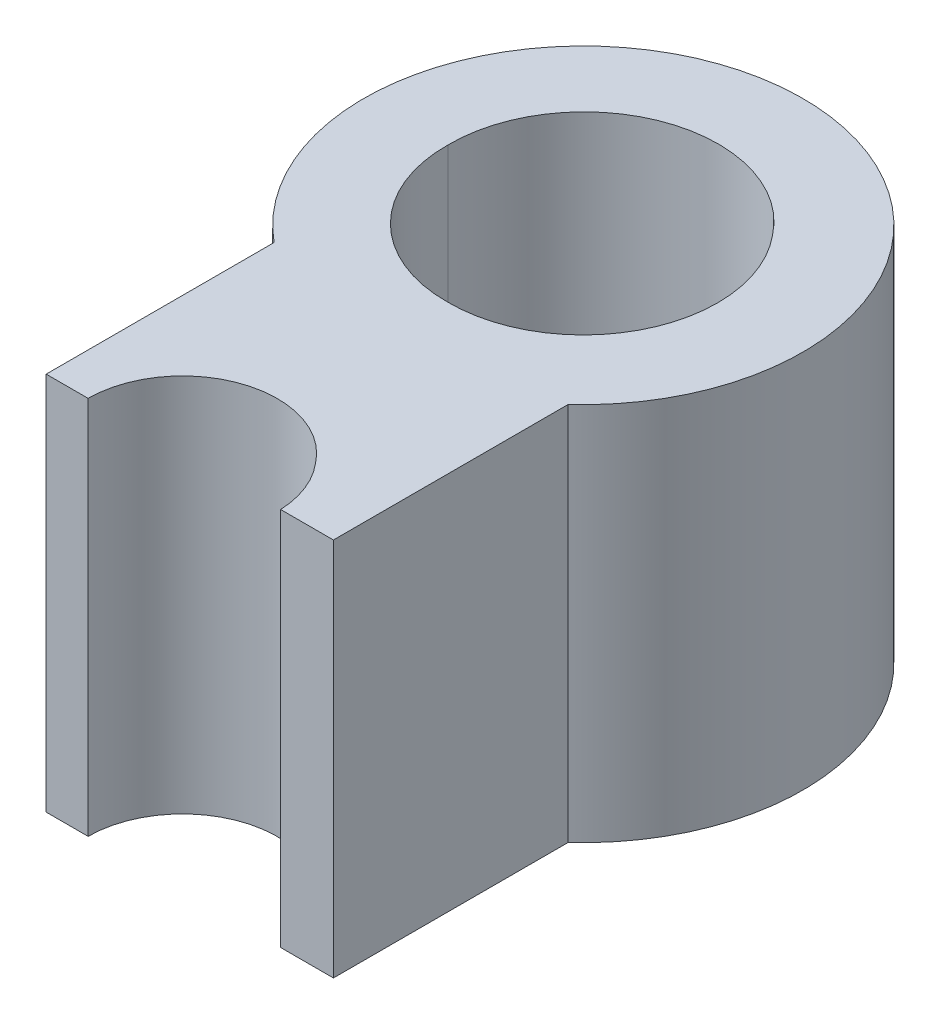
ISO-10303-21;
HEADER;
FILE_DESCRIPTION(('STEP AP214'),'2;1');
FILE_NAME('part.step','',(''),(''),'','','');
FILE_SCHEMA(('AUTOMOTIVE_DESIGN { 1 0 10303 214 1 1 1 1 }'));
ENDSEC;
DATA;
#1=APPLICATION_CONTEXT('core data for automotive mechanical design processes');
#2=APPLICATION_PROTOCOL_DEFINITION('international standard','automotive_design',2000,#1);
#3=PRODUCT_CONTEXT('',#1,'mechanical');
#4=PRODUCT('Part','Part','',(#3));
#5=PRODUCT_RELATED_PRODUCT_CATEGORY('part','',(#4));
#6=PRODUCT_DEFINITION_FORMATION('','',#4);
#7=PRODUCT_DEFINITION_CONTEXT('part definition',#1,'design');
#8=PRODUCT_DEFINITION('design','',#6,#7);
#9=PRODUCT_DEFINITION_SHAPE('','',#8);
#10=(LENGTH_UNIT() NAMED_UNIT(*) SI_UNIT(.MILLI.,.METRE.));
#11=(NAMED_UNIT(*) PLANE_ANGLE_UNIT() SI_UNIT($,.RADIAN.));
#12=(NAMED_UNIT(*) SI_UNIT($,.STERADIAN.) SOLID_ANGLE_UNIT());
#13=UNCERTAINTY_MEASURE_WITH_UNIT(LENGTH_MEASURE(1.E-05),#10,'distance_accuracy_value','');
#14=(GEOMETRIC_REPRESENTATION_CONTEXT(3) GLOBAL_UNCERTAINTY_ASSIGNED_CONTEXT((#13)) GLOBAL_UNIT_ASSIGNED_CONTEXT((#10,
#11,#12)) REPRESENTATION_CONTEXT('',''));
#15=CARTESIAN_POINT('',(0.,0.,0.));
#16=DIRECTION('',(0.,0.,1.));
#17=DIRECTION('',(1.,0.,0.));
#18=AXIS2_PLACEMENT_3D('',#15,#16,#17);
#19=CARTESIAN_POINT('',(1.26536763995187,2.87183105039429,15.59112871048));
#20=DIRECTION('',(0.,1.,0.));
#21=DIRECTION('',(0.,0.,-1.));
#22=AXIS2_PLACEMENT_3D('',#19,#20,#21);
#23=PLANE('',#22);
#24=CARTESIAN_POINT('',(-1.36353236004818,2.87183105039429,23.2098996244558));
#25=DIRECTION('',(0.,1.,0.));
#26=DIRECTION('',(0.,0.,-1.));
#27=AXIS2_PLACEMENT_3D('',#24,#25,#26);
#28=CIRCLE('',#27,0.425);
#29=CARTESIAN_POINT('',(-1.78849365773671,2.87183105039429,23.204164167466));
#30=VERTEX_POINT('',#29);
#31=CARTESIAN_POINT('',(-1.35891580266906,2.87183105039429,23.6348745500666));
#32=VERTEX_POINT('',#31);
#33=EDGE_CURVE('E179',#30,#32,#28,.T.);
#34=ORIENTED_EDGE('',*,*,#33,.F.);
#35=CARTESIAN_POINT('',(-1.36353236004812,2.87183105039429,23.1984287104753));
#36=DIRECTION('',(0.,1.,0.));
#37=DIRECTION('',(0.,0.,1.));
#38=AXIS2_PLACEMENT_3D('',#35,#36,#37);
#39=CIRCLE('',#38,0.425);
#40=CARTESIAN_POINT('',(-1.02789155250383,2.87183105039429,22.9377176667674));
#41=VERTEX_POINT('',#40);
#42=EDGE_CURVE('E219',#41,#30,#39,.T.);
#43=ORIENTED_EDGE('',*,*,#42,.F.);
#44=CARTESIAN_POINT('',(-1.35429924528842,2.87183105039429,23.2098996244558));
#45=DIRECTION('',(0.,1.,0.));
#46=DIRECTION('',(0.,0.,-1.));
#47=AXIS2_PLACEMENT_3D('',#44,#45,#46);
#48=CIRCLE('',#47,0.425);
#49=EDGE_CURVE('E156',#32,#41,#48,.T.);
#50=ORIENTED_EDGE('',*,*,#49,.F.);
#51=EDGE_LOOP('',(#34,#43,#50));
#52=FACE_BOUND('',#51,.T.);
#53=CARTESIAN_POINT('',(-1.3542992452884,2.87183105039429,24.4798996244558));
#54=DIRECTION('',(0.,1.,0.));
#55=DIRECTION('',(0.999103542626486,0.,-0.0423333333344553));
#56=AXIS2_PLACEMENT_3D('',#53,#54,#55);
#57=CIRCLE('',#56,0.299999999999992);
#58=CARTESIAN_POINT('',(-1.05456818250046,2.87183105039429,24.4671996244555));
#59=VERTEX_POINT('',#58);
#60=CARTESIAN_POINT('',(-1.12528694577581,2.87183105039429,24.2861127139795));
#61=VERTEX_POINT('',#60);
#62=EDGE_CURVE('E124',#59,#61,#57,.T.);
#63=ORIENTED_EDGE('',*,*,#62,.F.);
#64=DIRECTION('',(-1.,0.,-1.06337566312106E-12));
#65=VECTOR('',#64,1.);
#66=CARTESIAN_POINT('',(-0.887484441405778,2.87183105039429,24.4671996244556));
#67=LINE('',#66,#65);
#68=CARTESIAN_POINT('',(-0.887484441405778,2.87183105039429,24.4671996244556));
#69=VERTEX_POINT('',#68);
#70=EDGE_CURVE('E225',#69,#59,#67,.T.);
#71=ORIENTED_EDGE('',*,*,#70,.F.);
#72=DIRECTION('',(5.02522919053297E-13,0.,-1.));
#73=VECTOR('',#72,1.);
#74=CARTESIAN_POINT('',(-0.887484441405778,2.87183105039429,24.4671996244556));
#75=LINE('',#74,#73);
#76=CARTESIAN_POINT('',(-0.887484441405405,2.87183105039429,23.7245472516448));
#77=VERTEX_POINT('',#76);
#78=EDGE_CURVE('E25',#69,#77,#75,.T.);
#79=ORIENTED_EDGE('',*,*,#78,.T.);
#80=CARTESIAN_POINT('',(-1.35429924528842,2.87183105039429,23.2098996244558));
#81=DIRECTION('',(0.,1.,0.));
#82=DIRECTION('',(0.,0.,-1.));
#83=AXIS2_PLACEMENT_3D('',#80,#81,#82);
#84=CIRCLE('',#83,0.694822453073876);
#85=CARTESIAN_POINT('',(-1.79617833416789,2.87183105039429,23.7461095759735));
#86=VERTEX_POINT('',#85);
#87=EDGE_CURVE('E11',#77,#86,#84,.T.);
#88=ORIENTED_EDGE('',*,*,#87,.T.);
#89=DIRECTION('',(-5.6636748734305E-13,0.,-1.));
#90=VECTOR('',#89,1.);
#91=CARTESIAN_POINT('',(-1.79617833416748,2.87183105039429,24.467199624456));
#92=LINE('',#91,#90);
#93=CARTESIAN_POINT('',(-1.79617833416748,2.87183105039429,24.467199624456));
#94=VERTEX_POINT('',#93);
#95=EDGE_CURVE('E198',#94,#86,#92,.T.);
#96=ORIENTED_EDGE('',*,*,#95,.F.);
#97=DIRECTION('',(1.,0.,-1.62432664225037E-12));
#98=VECTOR('',#97,1.);
#99=CARTESIAN_POINT('',(-1.79617833416748,2.87183105039429,24.467199624456));
#100=LINE('',#99,#98);
#101=CARTESIAN_POINT('',(-1.66352984228345,2.87183105039429,24.4671996244558));
#102=VERTEX_POINT('',#101);
#103=EDGE_CURVE('E129',#94,#102,#100,.T.);
#104=ORIENTED_EDGE('',*,*,#103,.T.);
#105=CARTESIAN_POINT('',(-1.3635323600481,2.87183105039429,24.4684287104753));
#106=DIRECTION('',(0.,1.,0.));
#107=DIRECTION('',(0.999103542626609,0.,0.0423333333315546));
#108=AXIS2_PLACEMENT_3D('',#105,#106,#107);
#109=CIRCLE('',#108,0.299999999999991);
#110=EDGE_CURVE('E128',#61,#102,#109,.T.);
#111=ORIENTED_EDGE('',*,*,#110,.F.);
#112=EDGE_LOOP('',(#63,#71,#79,#88,#96,#104,#111));
#113=FACE_BOUND('',#112,.T.);
#114=ADVANCED_FACE('F17',(#52,#113),#23,.T.);
#115=CARTESIAN_POINT('',(-1.35429924528842,2.87183105039429,23.2098996244558));
#116=DIRECTION('',(0.,-1.,0.));
#117=DIRECTION('',(0.,0.,-1.));
#118=AXIS2_PLACEMENT_3D('',#115,#116,#117);
#119=CYLINDRICAL_SURFACE('',#118,0.694822453073876);
#120=CARTESIAN_POINT('',(-1.35429924528842,1.6718310055699,23.2098996244558));
#121=DIRECTION('',(0.,1.,0.));
#122=DIRECTION('',(0.,0.,-1.));
#123=AXIS2_PLACEMENT_3D('',#120,#121,#122);
#124=CIRCLE('',#123,0.694822453073876);
#125=CARTESIAN_POINT('',(-0.887484441405397,1.6718310055699,23.7245472516448));
#126=VERTEX_POINT('',#125);
#127=CARTESIAN_POINT('',(-1.79617833416788,1.6718310055699,23.7461095759735));
#128=VERTEX_POINT('',#127);
#129=EDGE_CURVE('E164',#126,#128,#124,.T.);
#130=ORIENTED_EDGE('',*,*,#129,.T.);
#131=DIRECTION('',(0.,-1.,0.));
#132=VECTOR('',#131,1.);
#133=CARTESIAN_POINT('',(-1.79617833416789,2.87183105039429,23.7461095759735));
#134=LINE('',#133,#132);
#135=EDGE_CURVE('E204',#86,#128,#134,.T.);
#136=ORIENTED_EDGE('',*,*,#135,.F.);
#137=ORIENTED_EDGE('',*,*,#87,.F.);
#138=DIRECTION('',(0.,-1.,0.));
#139=VECTOR('',#138,1.);
#140=CARTESIAN_POINT('',(-0.887484441405405,2.87183105039429,23.7245472516448));
#141=LINE('',#140,#139);
#142=EDGE_CURVE('E228',#77,#126,#141,.T.);
#143=ORIENTED_EDGE('',*,*,#142,.T.);
#144=EDGE_LOOP('',(#130,#136,#137,#143));
#145=FACE_BOUND('',#144,.T.);
#146=ADVANCED_FACE('F238',(#145),#119,.T.);
#147=CARTESIAN_POINT('',(-0.887484441405405,2.87183105039429,23.7245472516448));
#148=DIRECTION('',(1.,0.,5.02522919053297E-13));
#149=DIRECTION('',(-5.02522919053297E-13,0.,1.));
#150=AXIS2_PLACEMENT_3D('',#147,#148,#149);
#151=PLANE('',#150);
#152=DIRECTION('',(5.02522919053297E-13,0.,-1.));
#153=VECTOR('',#152,1.);
#154=CARTESIAN_POINT('',(-0.887484441403361,1.6718310055699,19.6578379810618));
#155=LINE('',#154,#153);
#156=CARTESIAN_POINT('',(-0.88748444140577,1.6718310055699,24.4671996244556));
#157=VERTEX_POINT('',#156);
#158=EDGE_CURVE('E168',#157,#126,#155,.T.);
#159=ORIENTED_EDGE('',*,*,#158,.T.);
#160=ORIENTED_EDGE('',*,*,#142,.F.);
#161=ORIENTED_EDGE('',*,*,#78,.F.);
#162=DIRECTION('',(0.,-1.,0.));
#163=VECTOR('',#162,1.);
#164=CARTESIAN_POINT('',(-0.887484441405778,2.87183105039429,24.4671996244556));
#165=LINE('',#164,#163);
#166=EDGE_CURVE('E222',#69,#157,#165,.T.);
#167=ORIENTED_EDGE('',*,*,#166,.T.);
#168=EDGE_LOOP('',(#159,#160,#161,#167));
#169=FACE_BOUND('',#168,.T.);
#170=ADVANCED_FACE('F236',(#169),#151,.T.);
#171=CARTESIAN_POINT('',(-0.887484441405778,2.87183105039429,24.4671996244556));
#172=DIRECTION('',(-1.06337566312106E-12,0.,1.));
#173=DIRECTION('',(1.,0.,1.06337566312106E-12));
#174=AXIS2_PLACEMENT_3D('',#171,#172,#173);
#175=PLANE('',#174);
#176=DIRECTION('',(1.,0.,1.06337566312106E-12));
#177=VECTOR('',#176,1.);
#178=CARTESIAN_POINT('',(0.188941599268329,1.6718310055699,24.4671996244568));
#179=LINE('',#178,#177);
#180=CARTESIAN_POINT('',(-1.05456818250045,1.6718310055699,24.4671996244555));
#181=VERTEX_POINT('',#180);
#182=EDGE_CURVE('E146',#181,#157,#179,.T.);
#183=ORIENTED_EDGE('',*,*,#182,.T.);
#184=ORIENTED_EDGE('',*,*,#166,.F.);
#185=ORIENTED_EDGE('',*,*,#70,.T.);
#186=DIRECTION('',(0.,-1.,0.));
#187=VECTOR('',#186,1.);
#188=CARTESIAN_POINT('',(-1.05456818250046,2.87183105039429,24.4671996244555));
#189=LINE('',#188,#187);
#190=EDGE_CURVE('E214',#59,#181,#189,.T.);
#191=ORIENTED_EDGE('',*,*,#190,.T.);
#192=EDGE_LOOP('',(#183,#184,#185,#191));
#193=FACE_BOUND('',#192,.T.);
#194=ADVANCED_FACE('F285',(#193),#175,.T.);
#195=CARTESIAN_POINT('',(-1.36353236004812,2.87183105039429,23.1984287104753));
#196=DIRECTION('',(0.,-1.,0.));
#197=DIRECTION('',(-0.330611026415633,0.,-0.943767105387977));
#198=AXIS2_PLACEMENT_3D('',#195,#196,#197);
#199=CYLINDRICAL_SURFACE('',#198,0.425);
#200=CARTESIAN_POINT('',(-1.36353236004812,1.6718310055699,23.1984287104753));
#201=DIRECTION('',(0.,-1.,0.));
#202=DIRECTION('',(0.,0.,1.));
#203=AXIS2_PLACEMENT_3D('',#200,#201,#202);
#204=CIRCLE('',#203,0.425);
#205=CARTESIAN_POINT('',(-1.7884936577367,1.6718310055699,23.204164167466));
#206=VERTEX_POINT('',#205);
#207=CARTESIAN_POINT('',(-1.02789155250382,1.6718310055699,22.9377176667674));
#208=VERTEX_POINT('',#207);
#209=EDGE_CURVE('E157',#206,#208,#204,.T.);
#210=ORIENTED_EDGE('',*,*,#209,.T.);
#211=DIRECTION('',(0.,-1.,0.));
#212=VECTOR('',#211,1.);
#213=CARTESIAN_POINT('',(-1.02789155250383,2.87183105039429,22.9377176667674));
#214=LINE('',#213,#212);
#215=EDGE_CURVE('E190',#41,#208,#214,.T.);
#216=ORIENTED_EDGE('',*,*,#215,.F.);
#217=ORIENTED_EDGE('',*,*,#42,.T.);
#218=DIRECTION('',(0.,-1.,0.));
#219=VECTOR('',#218,1.);
#220=CARTESIAN_POINT('',(-1.78849365773671,2.87183105039429,23.204164167466));
#221=LINE('',#220,#219);
#222=EDGE_CURVE('E183',#30,#206,#221,.T.);
#223=ORIENTED_EDGE('',*,*,#222,.T.);
#224=EDGE_LOOP('',(#210,#216,#217,#223));
#225=FACE_BOUND('',#224,.T.);
#226=ADVANCED_FACE('F270',(#225),#199,.F.);
#227=CARTESIAN_POINT('',(-1.3542992452884,2.87183105039429,24.4798996244558));
#228=DIRECTION('',(0.,-1.,0.));
#229=DIRECTION('',(0.999103542626486,0.,-0.0423333333344553));
#230=AXIS2_PLACEMENT_3D('',#227,#228,#229);
#231=CYLINDRICAL_SURFACE('',#230,0.299999999999992);
#232=CARTESIAN_POINT('',(-1.3542992452884,1.6718310055699,24.4798996244558));
#233=DIRECTION('',(0.,-1.,0.));
#234=DIRECTION('',(0.999103542626486,0.,-0.0423333333344553));
#235=AXIS2_PLACEMENT_3D('',#232,#233,#234);
#236=CIRCLE('',#235,0.299999999999992);
#237=CARTESIAN_POINT('',(-1.1252869457758,1.6718310055699,24.2861127139795));
#238=VERTEX_POINT('',#237);
#239=EDGE_CURVE('E122',#238,#181,#236,.T.);
#240=ORIENTED_EDGE('',*,*,#239,.T.);
#241=ORIENTED_EDGE('',*,*,#190,.F.);
#242=ORIENTED_EDGE('',*,*,#62,.T.);
#243=DIRECTION('',(0.,-1.,0.));
#244=VECTOR('',#243,1.);
#245=CARTESIAN_POINT('',(-1.12528694577581,2.87183105039429,24.2861127139795));
#246=LINE('',#245,#244);
#247=EDGE_CURVE('E117',#61,#238,#246,.T.);
#248=ORIENTED_EDGE('',*,*,#247,.T.);
#249=EDGE_LOOP('',(#240,#241,#242,#248));
#250=FACE_BOUND('',#249,.T.);
#251=ADVANCED_FACE('F119',(#250),#231,.F.);
#252=CARTESIAN_POINT('',(-1.3635323600481,2.87183105039429,24.4684287104753));
#253=DIRECTION('',(0.,-1.,0.));
#254=DIRECTION('',(-0.31887731463319,0.,-0.947796000314585));
#255=AXIS2_PLACEMENT_3D('',#252,#253,#254);
#256=CYLINDRICAL_SURFACE('',#255,0.299999999999991);
#257=CARTESIAN_POINT('',(-1.3635323600481,1.6718310055699,24.4684287104753));
#258=DIRECTION('',(0.,-1.,0.));
#259=DIRECTION('',(0.999103542626609,0.,0.0423333333315546));
#260=AXIS2_PLACEMENT_3D('',#257,#258,#259);
#261=CIRCLE('',#260,0.299999999999991);
#262=CARTESIAN_POINT('',(-1.66352984228344,1.6718310055699,24.4671996244558));
#263=VERTEX_POINT('',#262);
#264=EDGE_CURVE('E132',#263,#238,#261,.T.);
#265=ORIENTED_EDGE('',*,*,#264,.T.);
#266=ORIENTED_EDGE('',*,*,#247,.F.);
#267=ORIENTED_EDGE('',*,*,#110,.T.);
#268=DIRECTION('',(0.,-1.,0.));
#269=VECTOR('',#268,1.);
#270=CARTESIAN_POINT('',(-1.66352984228345,2.87183105039429,24.4671996244558));
#271=LINE('',#270,#269);
#272=EDGE_CURVE('E135',#102,#263,#271,.T.);
#273=ORIENTED_EDGE('',*,*,#272,.T.);
#274=EDGE_LOOP('',(#265,#266,#267,#273));
#275=FACE_BOUND('',#274,.T.);
#276=ADVANCED_FACE('F133',(#275),#256,.F.);
#277=CARTESIAN_POINT('',(-1.66352984228345,2.87183105039429,24.4671996244558));
#278=DIRECTION('',(1.62432664225037E-12,0.,1.));
#279=DIRECTION('',(1.,0.,-1.62432664225037E-12));
#280=AXIS2_PLACEMENT_3D('',#277,#278,#279);
#281=PLANE('',#280);
#282=DIRECTION('',(1.,0.,-1.62432664225037E-12));
#283=VECTOR('',#282,1.);
#284=CARTESIAN_POINT('',(-0.19908110115858,1.6718310055699,24.4671996244534));
#285=LINE('',#284,#283);
#286=CARTESIAN_POINT('',(-1.79617833416747,1.6718310055699,24.467199624456));
#287=VERTEX_POINT('',#286);
#288=EDGE_CURVE('E140',#287,#263,#285,.T.);
#289=ORIENTED_EDGE('',*,*,#288,.T.);
#290=ORIENTED_EDGE('',*,*,#272,.F.);
#291=ORIENTED_EDGE('',*,*,#103,.F.);
#292=DIRECTION('',(0.,-1.,0.));
#293=VECTOR('',#292,1.);
#294=CARTESIAN_POINT('',(-1.79617833416748,2.87183105039429,24.467199624456));
#295=LINE('',#294,#293);
#296=EDGE_CURVE('E182',#94,#287,#295,.T.);
#297=ORIENTED_EDGE('',*,*,#296,.T.);
#298=EDGE_LOOP('',(#289,#290,#291,#297));
#299=FACE_BOUND('',#298,.T.);
#300=ADVANCED_FACE('F244',(#299),#281,.T.);
#301=CARTESIAN_POINT('',(-1.79617833416748,2.87183105039429,24.467199624456));
#302=DIRECTION('',(-1.,0.,5.6636748734305E-13));
#303=DIRECTION('',(0.,1.,0.));
#304=AXIS2_PLACEMENT_3D('',#301,#302,#303);
#305=PLANE('',#304);
#306=DIRECTION('',(5.6636748734305E-13,0.,1.));
#307=VECTOR('',#306,1.);
#308=CARTESIAN_POINT('',(-1.79617833416999,1.6718310055699,20.0291641674689));
#309=LINE('',#308,#307);
#310=EDGE_CURVE('E159',#128,#287,#309,.T.);
#311=ORIENTED_EDGE('',*,*,#310,.T.);
#312=ORIENTED_EDGE('',*,*,#296,.F.);
#313=ORIENTED_EDGE('',*,*,#95,.T.);
#314=ORIENTED_EDGE('',*,*,#135,.T.);
#315=EDGE_LOOP('',(#311,#312,#313,#314));
#316=FACE_BOUND('',#315,.T.);
#317=ADVANCED_FACE('F242',(#316),#305,.T.);
#318=CARTESIAN_POINT('',(-1.36353236004818,2.87183105039429,23.2098996244558));
#319=DIRECTION('',(0.,-1.,0.));
#320=DIRECTION('',(-0.708037039269053,0.,0.70617529765853));
#321=AXIS2_PLACEMENT_3D('',#318,#319,#320);
#322=CYLINDRICAL_SURFACE('',#321,0.425);
#323=CARTESIAN_POINT('',(-1.36353236004818,1.6718310055699,23.2098996244558));
#324=DIRECTION('',(0.,-1.,0.));
#325=DIRECTION('',(0.,0.,-1.));
#326=AXIS2_PLACEMENT_3D('',#323,#324,#325);
#327=CIRCLE('',#326,0.425);
#328=CARTESIAN_POINT('',(-1.35891580266905,1.6718310055699,23.6348745500666));
#329=VERTEX_POINT('',#328);
#330=EDGE_CURVE('E171',#329,#206,#327,.T.);
#331=ORIENTED_EDGE('',*,*,#330,.T.);
#332=ORIENTED_EDGE('',*,*,#222,.F.);
#333=ORIENTED_EDGE('',*,*,#33,.T.);
#334=DIRECTION('',(0.,-1.,0.));
#335=VECTOR('',#334,1.);
#336=CARTESIAN_POINT('',(-1.35891580266906,2.87183105039429,23.6348745500666));
#337=LINE('',#336,#335);
#338=EDGE_CURVE('E153',#32,#329,#337,.T.);
#339=ORIENTED_EDGE('',*,*,#338,.T.);
#340=EDGE_LOOP('',(#331,#332,#333,#339));
#341=FACE_BOUND('',#340,.T.);
#342=ADVANCED_FACE('F252',(#341),#322,.F.);
#343=CARTESIAN_POINT('',(-1.35429924528842,2.87183105039429,23.2098996244558));
#344=DIRECTION('',(0.,-1.,0.));
#345=DIRECTION('',(0.903340402071769,0.,0.428924373269711));
#346=AXIS2_PLACEMENT_3D('',#343,#344,#345);
#347=CYLINDRICAL_SURFACE('',#346,0.425);
#348=CARTESIAN_POINT('',(-1.35429924528842,1.6718310055699,23.2098996244558));
#349=DIRECTION('',(0.,-1.,0.));
#350=DIRECTION('',(0.,0.,-1.));
#351=AXIS2_PLACEMENT_3D('',#348,#349,#350);
#352=CIRCLE('',#351,0.425);
#353=EDGE_CURVE('E178',#208,#329,#352,.T.);
#354=ORIENTED_EDGE('',*,*,#353,.T.);
#355=ORIENTED_EDGE('',*,*,#338,.F.);
#356=ORIENTED_EDGE('',*,*,#49,.T.);
#357=ORIENTED_EDGE('',*,*,#215,.T.);
#358=EDGE_LOOP('',(#354,#355,#356,#357));
#359=FACE_BOUND('',#358,.T.);
#360=ADVANCED_FACE('F274',(#359),#347,.F.);
#361=CARTESIAN_POINT('',(1.26536763995188,1.6718310055699,15.59112871048));
#362=DIRECTION('',(0.,1.,0.));
#363=DIRECTION('',(0.,0.,-1.));
#364=AXIS2_PLACEMENT_3D('',#361,#362,#363);
#365=PLANE('',#364);
#366=ORIENTED_EDGE('',*,*,#330,.F.);
#367=ORIENTED_EDGE('',*,*,#353,.F.);
#368=ORIENTED_EDGE('',*,*,#209,.F.);
#369=EDGE_LOOP('',(#366,#367,#368));
#370=FACE_BOUND('',#369,.T.);
#371=ORIENTED_EDGE('',*,*,#239,.F.);
#372=ORIENTED_EDGE('',*,*,#264,.F.);
#373=ORIENTED_EDGE('',*,*,#288,.F.);
#374=ORIENTED_EDGE('',*,*,#310,.F.);
#375=ORIENTED_EDGE('',*,*,#129,.F.);
#376=ORIENTED_EDGE('',*,*,#158,.F.);
#377=ORIENTED_EDGE('',*,*,#182,.F.);
#378=EDGE_LOOP('',(#371,#372,#373,#374,#375,#376,#377));
#379=FACE_BOUND('',#378,.T.);
#380=ADVANCED_FACE('F143',(#370,#379),#365,.F.);
#381=CLOSED_SHELL('',(#114,#146,#170,#194,#226,#251,#276,#300,#317,#342,#360,#380));
#382=MANIFOLD_SOLID_BREP('B1',#381);
#383=ADVANCED_BREP_SHAPE_REPRESENTATION('',(#18,#382),#14);
#384=SHAPE_DEFINITION_REPRESENTATION(#9,#383);
ENDSEC;
END-ISO-10303-21;
